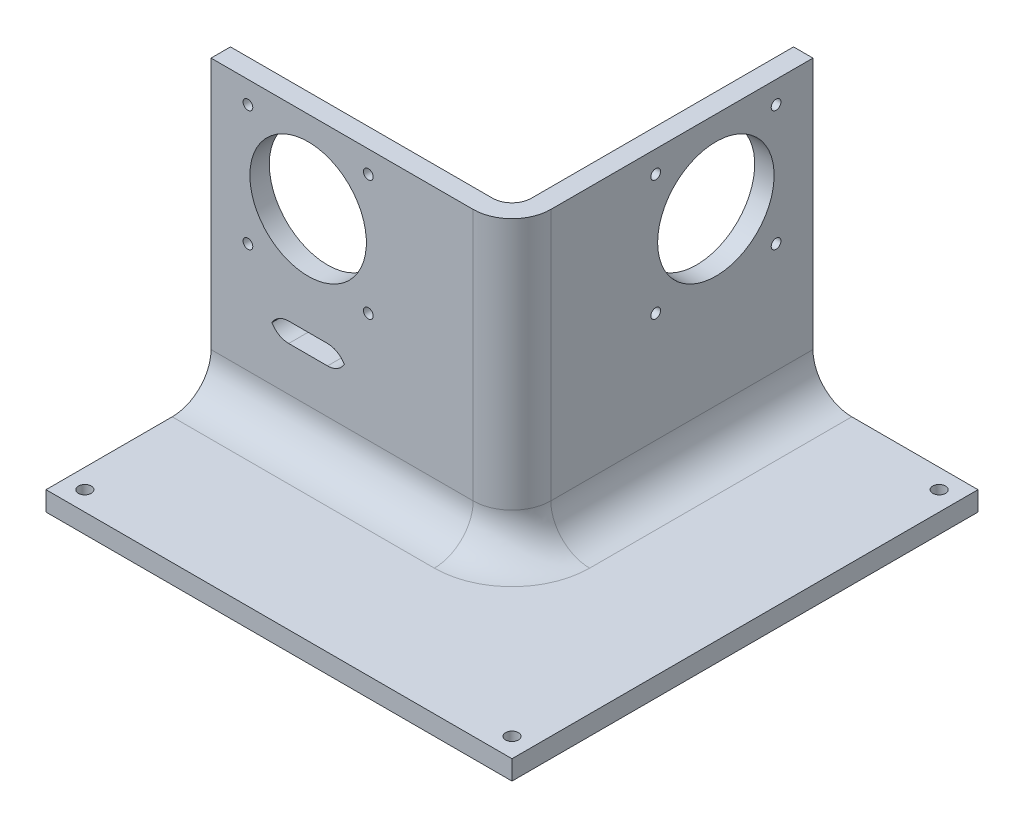
ISO-10303-21;
HEADER;
FILE_DESCRIPTION(('STEP AP214'),'2;1');
FILE_NAME('part.step','',(''),(''),'','','');
FILE_SCHEMA(('AUTOMOTIVE_DESIGN { 1 0 10303 214 1 1 1 1 }'));
ENDSEC;
DATA;
#1=APPLICATION_CONTEXT('core data for automotive mechanical design processes');
#2=APPLICATION_PROTOCOL_DEFINITION('international standard','automotive_design',2000,#1);
#3=PRODUCT_CONTEXT('',#1,'mechanical');
#4=PRODUCT('Part','Part','',(#3));
#5=PRODUCT_RELATED_PRODUCT_CATEGORY('part','',(#4));
#6=PRODUCT_DEFINITION_FORMATION('','',#4);
#7=PRODUCT_DEFINITION_CONTEXT('part definition',#1,'design');
#8=PRODUCT_DEFINITION('design','',#6,#7);
#9=PRODUCT_DEFINITION_SHAPE('','',#8);
#10=(LENGTH_UNIT() NAMED_UNIT(*) SI_UNIT(.MILLI.,.METRE.));
#11=(NAMED_UNIT(*) PLANE_ANGLE_UNIT() SI_UNIT($,.RADIAN.));
#12=(NAMED_UNIT(*) SI_UNIT($,.STERADIAN.) SOLID_ANGLE_UNIT());
#13=UNCERTAINTY_MEASURE_WITH_UNIT(LENGTH_MEASURE(1.E-05),#10,'distance_accuracy_value','');
#14=(GEOMETRIC_REPRESENTATION_CONTEXT(3) GLOBAL_UNCERTAINTY_ASSIGNED_CONTEXT((#13)) GLOBAL_UNIT_ASSIGNED_CONTEXT((#10,
#11,#12)) REPRESENTATION_CONTEXT('',''));
#15=CARTESIAN_POINT('',(0.,0.,0.));
#16=DIRECTION('',(0.,0.,1.));
#17=DIRECTION('',(1.,0.,0.));
#18=AXIS2_PLACEMENT_3D('',#15,#16,#17);
#19=CARTESIAN_POINT('',(0.,20.,-72.5));
#20=DIRECTION('',(0.,0.,-1.));
#21=DIRECTION('',(-1.,0.,0.));
#22=AXIS2_PLACEMENT_3D('',#19,#20,#21);
#23=PLANE('',#22);
#24=DIRECTION('',(0.,-1.,0.));
#25=VECTOR('',#24,1.);
#26=CARTESIAN_POINT('',(5.,80.,-72.5));
#27=LINE('',#26,#25);
#28=CARTESIAN_POINT('',(5.,80.,-72.5));
#29=VERTEX_POINT('',#28);
#30=CARTESIAN_POINT('',(5.,15.,-72.5));
#31=VERTEX_POINT('',#30);
#32=EDGE_CURVE('E281',#29,#31,#27,.T.);
#33=ORIENTED_EDGE('',*,*,#32,.T.);
#34=CARTESIAN_POINT('',(15.,15.,-72.5));
#35=DIRECTION('',(0.,0.,-1.));
#36=DIRECTION('',(-1.,0.,0.));
#37=AXIS2_PLACEMENT_3D('',#34,#35,#36);
#38=CIRCLE('',#37,10.);
#39=CARTESIAN_POINT('',(15.,5.,-72.5));
#40=VERTEX_POINT('',#39);
#41=EDGE_CURVE('E364',#31,#40,#38,.F.);
#42=ORIENTED_EDGE('',*,*,#41,.T.);
#43=DIRECTION('',(-1.,0.,0.));
#44=VECTOR('',#43,1.);
#45=CARTESIAN_POINT('',(47.5,5.,-72.5));
#46=LINE('',#45,#44);
#47=CARTESIAN_POINT('',(47.5,5.,-72.5));
#48=VERTEX_POINT('',#47);
#49=EDGE_CURVE('E202',#48,#40,#46,.T.);
#50=ORIENTED_EDGE('',*,*,#49,.F.);
#51=DIRECTION('',(0.,1.,0.));
#52=VECTOR('',#51,1.);
#53=CARTESIAN_POINT('',(47.5,-80.,-72.5));
#54=LINE('',#53,#52);
#55=CARTESIAN_POINT('',(47.5,0.,-72.5));
#56=VERTEX_POINT('',#55);
#57=EDGE_CURVE('E211',#56,#48,#54,.T.);
#58=ORIENTED_EDGE('',*,*,#57,.F.);
#59=DIRECTION('',(1.,0.,0.));
#60=VECTOR('',#59,1.);
#61=CARTESIAN_POINT('',(0.,0.,-72.5));
#62=LINE('',#61,#60);
#63=CARTESIAN_POINT('',(0.,0.,-72.5));
#64=VERTEX_POINT('',#63);
#65=EDGE_CURVE('E292',#64,#56,#62,.T.);
#66=ORIENTED_EDGE('',*,*,#65,.F.);
#67=DIRECTION('',(0.,-1.,0.));
#68=VECTOR('',#67,1.);
#69=CARTESIAN_POINT('',(0.,20.,-72.5));
#70=LINE('',#69,#68);
#71=CARTESIAN_POINT('',(0.,80.,-72.5));
#72=VERTEX_POINT('',#71);
#73=EDGE_CURVE('E295',#72,#64,#70,.T.);
#74=ORIENTED_EDGE('',*,*,#73,.F.);
#75=DIRECTION('',(-1.,0.,0.));
#76=VECTOR('',#75,1.);
#77=CARTESIAN_POINT('',(0.,80.,-72.5));
#78=LINE('',#77,#76);
#79=EDGE_CURVE('E275',#29,#72,#78,.T.);
#80=ORIENTED_EDGE('',*,*,#79,.F.);
#81=EDGE_LOOP('',(#33,#42,#50,#58,#66,#74,#80));
#82=FACE_BOUND('',#81,.T.);
#83=ADVANCED_FACE('F58',(#82),#23,.T.);
#84=CARTESIAN_POINT('',(0.,0.,0.));
#85=DIRECTION('',(0.,1.,0.));
#86=DIRECTION('',(0.,0.,1.));
#87=AXIS2_PLACEMENT_3D('',#84,#85,#86);
#88=PLANE('',#87);
#89=CARTESIAN_POINT('',(42.5,0.,-67.5));
#90=DIRECTION('',(0.,1.,0.));
#91=DIRECTION('',(0.,0.,1.));
#92=AXIS2_PLACEMENT_3D('',#89,#90,#91);
#93=CIRCLE('',#92,1.65);
#94=CARTESIAN_POINT('',(42.5,0.,-65.85));
#95=VERTEX_POINT('',#94);
#96=EDGE_CURVE('E218',#95,#95,#93,.T.);
#97=ORIENTED_EDGE('',*,*,#96,.T.);
#98=EDGE_LOOP('',(#97));
#99=FACE_BOUND('',#98,.T.);
#100=CARTESIAN_POINT('',(42.5,0.,42.5));
#101=DIRECTION('',(0.,1.,0.));
#102=DIRECTION('',(0.,0.,1.));
#103=AXIS2_PLACEMENT_3D('',#100,#101,#102);
#104=CIRCLE('',#103,1.65);
#105=CARTESIAN_POINT('',(42.5,0.,44.15));
#106=VERTEX_POINT('',#105);
#107=EDGE_CURVE('E222',#106,#106,#104,.T.);
#108=ORIENTED_EDGE('',*,*,#107,.T.);
#109=EDGE_LOOP('',(#108));
#110=FACE_BOUND('',#109,.T.);
#111=CARTESIAN_POINT('',(-67.5,0.,42.5));
#112=DIRECTION('',(0.,1.,0.));
#113=DIRECTION('',(0.,0.,1.));
#114=AXIS2_PLACEMENT_3D('',#111,#112,#113);
#115=CIRCLE('',#114,1.65);
#116=CARTESIAN_POINT('',(-67.5,0.,44.15));
#117=VERTEX_POINT('',#116);
#118=EDGE_CURVE('E337',#117,#117,#115,.T.);
#119=ORIENTED_EDGE('',*,*,#118,.T.);
#120=EDGE_LOOP('',(#119));
#121=FACE_BOUND('',#120,.T.);
#122=DIRECTION('',(0.,0.,-1.));
#123=VECTOR('',#122,1.);
#124=CARTESIAN_POINT('',(47.5,0.,0.));
#125=LINE('',#124,#123);
#126=CARTESIAN_POINT('',(47.5,0.,47.5));
#127=VERTEX_POINT('',#126);
#128=EDGE_CURVE('E334',#127,#56,#125,.T.);
#129=ORIENTED_EDGE('',*,*,#128,.F.);
#130=DIRECTION('',(-1.,0.,0.));
#131=VECTOR('',#130,1.);
#132=CARTESIAN_POINT('',(0.,0.,47.5));
#133=LINE('',#132,#131);
#134=CARTESIAN_POINT('',(-72.5,0.,47.5));
#135=VERTEX_POINT('',#134);
#136=EDGE_CURVE('E216',#127,#135,#133,.T.);
#137=ORIENTED_EDGE('',*,*,#136,.T.);
#138=DIRECTION('',(0.,0.,-1.));
#139=VECTOR('',#138,1.);
#140=CARTESIAN_POINT('',(-72.5,0.,0.));
#141=LINE('',#140,#139);
#142=CARTESIAN_POINT('',(-72.5,0.,0.));
#143=VERTEX_POINT('',#142);
#144=EDGE_CURVE('E290',#135,#143,#141,.T.);
#145=ORIENTED_EDGE('',*,*,#144,.T.);
#146=DIRECTION('',(-1.,0.,0.));
#147=VECTOR('',#146,1.);
#148=CARTESIAN_POINT('',(0.,0.,0.));
#149=LINE('',#148,#147);
#150=CARTESIAN_POINT('',(-5.,0.,0.));
#151=VERTEX_POINT('',#150);
#152=EDGE_CURVE('E287',#151,#143,#149,.T.);
#153=ORIENTED_EDGE('',*,*,#152,.F.);
#154=CARTESIAN_POINT('',(-5.,0.,-5.));
#155=DIRECTION('',(0.,1.,0.));
#156=DIRECTION('',(0.,0.,1.));
#157=AXIS2_PLACEMENT_3D('',#154,#155,#156);
#158=CIRCLE('',#157,5.);
#159=CARTESIAN_POINT('',(0.,0.,-5.));
#160=VERTEX_POINT('',#159);
#161=EDGE_CURVE('E329',#151,#160,#158,.T.);
#162=ORIENTED_EDGE('',*,*,#161,.T.);
#163=DIRECTION('',(0.,0.,1.));
#164=VECTOR('',#163,1.);
#165=CARTESIAN_POINT('',(0.,0.,0.));
#166=LINE('',#165,#164);
#167=EDGE_CURVE('E284',#64,#160,#166,.T.);
#168=ORIENTED_EDGE('',*,*,#167,.F.);
#169=ORIENTED_EDGE('',*,*,#65,.T.);
#170=EDGE_LOOP('',(#129,#137,#145,#153,#162,#168,#169));
#171=FACE_BOUND('',#170,.T.);
#172=ADVANCED_FACE('F455',(#99,#110,#121,#171),#88,.F.);
#173=CARTESIAN_POINT('',(0.,20.,0.));
#174=DIRECTION('',(1.,0.,0.));
#175=DIRECTION('',(0.,0.,-1.));
#176=AXIS2_PLACEMENT_3D('',#173,#174,#175);
#177=PLANE('',#176);
#178=CARTESIAN_POINT('',(0.,43.35,-32.));
#179=DIRECTION('',(-1.,0.,0.));
#180=DIRECTION('',(0.,0.,1.));
#181=AXIS2_PLACEMENT_3D('',#178,#179,#180);
#182=CIRCLE('',#181,1.25);
#183=CARTESIAN_POINT('',(0.,43.35,-30.75));
#184=VERTEX_POINT('',#183);
#185=EDGE_CURVE('E255',#184,#184,#182,.T.);
#186=ORIENTED_EDGE('',*,*,#185,.F.);
#187=EDGE_LOOP('',(#186));
#188=FACE_BOUND('',#187,.T.);
#189=CARTESIAN_POINT('',(0.,43.35,-63.));
#190=DIRECTION('',(-1.,0.,0.));
#191=DIRECTION('',(0.,0.,1.));
#192=AXIS2_PLACEMENT_3D('',#189,#190,#191);
#193=CIRCLE('',#192,1.25);
#194=CARTESIAN_POINT('',(0.,43.35,-61.75));
#195=VERTEX_POINT('',#194);
#196=EDGE_CURVE('E260',#195,#195,#193,.T.);
#197=ORIENTED_EDGE('',*,*,#196,.F.);
#198=EDGE_LOOP('',(#197));
#199=FACE_BOUND('',#198,.T.);
#200=CARTESIAN_POINT('',(0.,74.35,-63.));
#201=DIRECTION('',(-1.,0.,0.));
#202=DIRECTION('',(0.,0.,1.));
#203=AXIS2_PLACEMENT_3D('',#200,#201,#202);
#204=CIRCLE('',#203,1.25);
#205=CARTESIAN_POINT('',(0.,74.35,-61.75));
#206=VERTEX_POINT('',#205);
#207=EDGE_CURVE('E256',#206,#206,#204,.T.);
#208=ORIENTED_EDGE('',*,*,#207,.F.);
#209=EDGE_LOOP('',(#208));
#210=FACE_BOUND('',#209,.T.);
#211=CARTESIAN_POINT('',(0.,74.35,-32.));
#212=DIRECTION('',(-1.,0.,0.));
#213=DIRECTION('',(0.,0.,1.));
#214=AXIS2_PLACEMENT_3D('',#211,#212,#213);
#215=CIRCLE('',#214,1.25);
#216=CARTESIAN_POINT('',(0.,74.35,-30.75));
#217=VERTEX_POINT('',#216);
#218=EDGE_CURVE('E259',#217,#217,#215,.T.);
#219=ORIENTED_EDGE('',*,*,#218,.F.);
#220=EDGE_LOOP('',(#219));
#221=FACE_BOUND('',#220,.T.);
#222=CARTESIAN_POINT('',(0.,58.85,-47.5));
#223=DIRECTION('',(-1.,0.,0.));
#224=DIRECTION('',(0.,0.,1.));
#225=AXIS2_PLACEMENT_3D('',#222,#223,#224);
#226=CIRCLE('',#225,15.);
#227=CARTESIAN_POINT('',(0.,58.85,-32.5));
#228=VERTEX_POINT('',#227);
#229=EDGE_CURVE('E268',#228,#228,#226,.T.);
#230=ORIENTED_EDGE('',*,*,#229,.F.);
#231=EDGE_LOOP('',(#230));
#232=FACE_BOUND('',#231,.T.);
#233=ORIENTED_EDGE('',*,*,#167,.T.);
#234=DIRECTION('',(0.,-1.,0.));
#235=VECTOR('',#234,1.);
#236=CARTESIAN_POINT('',(0.,80.,-5.));
#237=LINE('',#236,#235);
#238=CARTESIAN_POINT('',(0.,80.,-5.));
#239=VERTEX_POINT('',#238);
#240=EDGE_CURVE('E327',#160,#239,#237,.F.);
#241=ORIENTED_EDGE('',*,*,#240,.T.);
#242=DIRECTION('',(0.,0.,1.));
#243=VECTOR('',#242,1.);
#244=CARTESIAN_POINT('',(0.,80.,0.));
#245=LINE('',#244,#243);
#246=EDGE_CURVE('E278',#72,#239,#245,.T.);
#247=ORIENTED_EDGE('',*,*,#246,.F.);
#248=ORIENTED_EDGE('',*,*,#73,.T.);
#249=EDGE_LOOP('',(#233,#241,#247,#248));
#250=FACE_BOUND('',#249,.T.);
#251=ADVANCED_FACE('F461',(#188,#199,#210,#221,#232,#250),#177,.F.);
#252=CARTESIAN_POINT('',(0.,20.,0.));
#253=DIRECTION('',(0.,0.,1.));
#254=DIRECTION('',(1.,0.,0.));
#255=AXIS2_PLACEMENT_3D('',#252,#253,#254);
#256=PLANE('',#255);
#257=DIRECTION('',(-1.,0.,0.));
#258=VECTOR('',#257,1.);
#259=CARTESIAN_POINT('',(0.,31.35,0.));
#260=LINE('',#259,#258);
#261=CARTESIAN_POINT('',(-42.5,31.35,0.));
#262=VERTEX_POINT('',#261);
#263=CARTESIAN_POINT('',(-52.5,31.35,0.));
#264=VERTEX_POINT('',#263);
#265=EDGE_CURVE('E421',#262,#264,#260,.T.);
#266=ORIENTED_EDGE('',*,*,#265,.T.);
#267=CARTESIAN_POINT('',(-52.5,26.35,0.));
#268=DIRECTION('',(0.,0.,1.));
#269=DIRECTION('',(1.,0.,0.));
#270=AXIS2_PLACEMENT_3D('',#267,#268,#269);
#271=CIRCLE('',#270,5.);
#272=CARTESIAN_POINT('',(-56.8301270189222,28.85,0.));
#273=VERTEX_POINT('',#272);
#274=EDGE_CURVE('E392',#264,#273,#271,.T.);
#275=ORIENTED_EDGE('',*,*,#274,.T.);
#276=CARTESIAN_POINT('',(-52.5,31.35,0.));
#277=DIRECTION('',(0.,0.,1.));
#278=DIRECTION('',(1.,0.,0.));
#279=AXIS2_PLACEMENT_3D('',#276,#277,#278);
#280=CIRCLE('',#279,5.);
#281=CARTESIAN_POINT('',(-52.5,26.35,0.));
#282=VERTEX_POINT('',#281);
#283=EDGE_CURVE('E388',#273,#282,#280,.T.);
#284=ORIENTED_EDGE('',*,*,#283,.T.);
#285=DIRECTION('',(1.,0.,0.));
#286=VECTOR('',#285,1.);
#287=CARTESIAN_POINT('',(0.,26.35,0.));
#288=LINE('',#287,#286);
#289=CARTESIAN_POINT('',(-42.5,26.35,0.));
#290=VERTEX_POINT('',#289);
#291=EDGE_CURVE('E371',#282,#290,#288,.T.);
#292=ORIENTED_EDGE('',*,*,#291,.T.);
#293=CARTESIAN_POINT('',(-42.5,31.35,0.));
#294=DIRECTION('',(0.,0.,1.));
#295=DIRECTION('',(1.,0.,0.));
#296=AXIS2_PLACEMENT_3D('',#293,#294,#295);
#297=CIRCLE('',#296,5.);
#298=CARTESIAN_POINT('',(-38.1698729810778,28.85,0.));
#299=VERTEX_POINT('',#298);
#300=EDGE_CURVE('E12',#290,#299,#297,.T.);
#301=ORIENTED_EDGE('',*,*,#300,.T.);
#302=CARTESIAN_POINT('',(-42.5,26.35,0.));
#303=DIRECTION('',(0.,0.,1.));
#304=DIRECTION('',(1.,0.,0.));
#305=AXIS2_PLACEMENT_3D('',#302,#303,#304);
#306=CIRCLE('',#305,5.);
#307=EDGE_CURVE('E395',#299,#262,#306,.T.);
#308=ORIENTED_EDGE('',*,*,#307,.T.);
#309=EDGE_LOOP('',(#266,#275,#284,#292,#301,#308));
#310=FACE_BOUND('',#309,.T.);
#311=CARTESIAN_POINT('',(-32.,43.35,0.));
#312=DIRECTION('',(0.,0.,1.));
#313=DIRECTION('',(1.,0.,0.));
#314=AXIS2_PLACEMENT_3D('',#311,#312,#313);
#315=CIRCLE('',#314,1.25);
#316=CARTESIAN_POINT('',(-30.75,43.35,0.));
#317=VERTEX_POINT('',#316);
#318=EDGE_CURVE('E233',#317,#317,#315,.T.);
#319=ORIENTED_EDGE('',*,*,#318,.T.);
#320=EDGE_LOOP('',(#319));
#321=FACE_BOUND('',#320,.T.);
#322=CARTESIAN_POINT('',(-63.,43.35,0.));
#323=DIRECTION('',(0.,0.,1.));
#324=DIRECTION('',(1.,0.,0.));
#325=AXIS2_PLACEMENT_3D('',#322,#323,#324);
#326=CIRCLE('',#325,1.25);
#327=CARTESIAN_POINT('',(-61.75,43.35,0.));
#328=VERTEX_POINT('',#327);
#329=EDGE_CURVE('E230',#328,#328,#326,.T.);
#330=ORIENTED_EDGE('',*,*,#329,.T.);
#331=EDGE_LOOP('',(#330));
#332=FACE_BOUND('',#331,.T.);
#333=CARTESIAN_POINT('',(-63.,74.35,0.));
#334=DIRECTION('',(0.,0.,1.));
#335=DIRECTION('',(1.,0.,0.));
#336=AXIS2_PLACEMENT_3D('',#333,#334,#335);
#337=CIRCLE('',#336,1.25);
#338=CARTESIAN_POINT('',(-61.75,74.35,0.));
#339=VERTEX_POINT('',#338);
#340=EDGE_CURVE('E226',#339,#339,#337,.T.);
#341=ORIENTED_EDGE('',*,*,#340,.T.);
#342=EDGE_LOOP('',(#341));
#343=FACE_BOUND('',#342,.T.);
#344=CARTESIAN_POINT('',(-32.,74.35,0.));
#345=DIRECTION('',(0.,0.,1.));
#346=DIRECTION('',(1.,0.,0.));
#347=AXIS2_PLACEMENT_3D('',#344,#345,#346);
#348=CIRCLE('',#347,1.25);
#349=CARTESIAN_POINT('',(-30.75,74.35,0.));
#350=VERTEX_POINT('',#349);
#351=EDGE_CURVE('E229',#350,#350,#348,.T.);
#352=ORIENTED_EDGE('',*,*,#351,.T.);
#353=EDGE_LOOP('',(#352));
#354=FACE_BOUND('',#353,.T.);
#355=CARTESIAN_POINT('',(-47.5,58.85,0.));
#356=DIRECTION('',(0.,0.,1.));
#357=DIRECTION('',(1.,0.,0.));
#358=AXIS2_PLACEMENT_3D('',#355,#356,#357);
#359=CIRCLE('',#358,15.);
#360=CARTESIAN_POINT('',(-32.5,58.85,0.));
#361=VERTEX_POINT('',#360);
#362=EDGE_CURVE('E239',#361,#361,#359,.T.);
#363=ORIENTED_EDGE('',*,*,#362,.T.);
#364=EDGE_LOOP('',(#363));
#365=FACE_BOUND('',#364,.T.);
#366=DIRECTION('',(-1.,0.,0.));
#367=VECTOR('',#366,1.);
#368=CARTESIAN_POINT('',(-72.5,80.,0.));
#369=LINE('',#368,#367);
#370=CARTESIAN_POINT('',(-5.,80.,0.));
#371=VERTEX_POINT('',#370);
#372=CARTESIAN_POINT('',(-72.5,80.,0.));
#373=VERTEX_POINT('',#372);
#374=EDGE_CURVE('E250',#371,#373,#369,.T.);
#375=ORIENTED_EDGE('',*,*,#374,.F.);
#376=DIRECTION('',(0.,-1.,0.));
#377=VECTOR('',#376,1.);
#378=CARTESIAN_POINT('',(-5.,0.,0.));
#379=LINE('',#378,#377);
#380=EDGE_CURVE('E300',#371,#151,#379,.T.);
#381=ORIENTED_EDGE('',*,*,#380,.T.);
#382=ORIENTED_EDGE('',*,*,#152,.T.);
#383=DIRECTION('',(0.,-1.,0.));
#384=VECTOR('',#383,1.);
#385=CARTESIAN_POINT('',(-72.5,20.,0.));
#386=LINE('',#385,#384);
#387=EDGE_CURVE('E297',#373,#143,#386,.T.);
#388=ORIENTED_EDGE('',*,*,#387,.F.);
#389=EDGE_LOOP('',(#375,#381,#382,#388));
#390=FACE_BOUND('',#389,.T.);
#391=ADVANCED_FACE('F470',(#310,#321,#332,#343,#354,#365,#390),#256,.F.);
#392=CARTESIAN_POINT('',(-72.5,20.,0.));
#393=DIRECTION('',(-1.,0.,0.));
#394=DIRECTION('',(0.,0.,1.));
#395=AXIS2_PLACEMENT_3D('',#392,#393,#394);
#396=PLANE('',#395);
#397=DIRECTION('',(0.,0.,1.));
#398=VECTOR('',#397,1.);
#399=CARTESIAN_POINT('',(-72.5,5.,5.00000000000002));
#400=LINE('',#399,#398);
#401=CARTESIAN_POINT('',(-72.5,5.,15.));
#402=VERTEX_POINT('',#401);
#403=CARTESIAN_POINT('',(-72.5,5.,47.5));
#404=VERTEX_POINT('',#403);
#405=EDGE_CURVE('E198',#402,#404,#400,.T.);
#406=ORIENTED_EDGE('',*,*,#405,.F.);
#407=CARTESIAN_POINT('',(-72.5,15.,15.));
#408=DIRECTION('',(-1.,0.,0.));
#409=DIRECTION('',(0.,0.,1.));
#410=AXIS2_PLACEMENT_3D('',#407,#408,#409);
#411=CIRCLE('',#410,10.);
#412=CARTESIAN_POINT('',(-72.5,15.,5.00000000000001));
#413=VERTEX_POINT('',#412);
#414=EDGE_CURVE('E362',#402,#413,#411,.F.);
#415=ORIENTED_EDGE('',*,*,#414,.T.);
#416=DIRECTION('',(0.,-1.,0.));
#417=VECTOR('',#416,1.);
#418=CARTESIAN_POINT('',(-72.5,80.,5.00000000000001));
#419=LINE('',#418,#417);
#420=CARTESIAN_POINT('',(-72.5,80.,5.00000000000001));
#421=VERTEX_POINT('',#420);
#422=EDGE_CURVE('E252',#421,#413,#419,.T.);
#423=ORIENTED_EDGE('',*,*,#422,.F.);
#424=DIRECTION('',(0.,0.,1.));
#425=VECTOR('',#424,1.);
#426=CARTESIAN_POINT('',(-72.5,80.,0.));
#427=LINE('',#426,#425);
#428=EDGE_CURVE('E244',#373,#421,#427,.T.);
#429=ORIENTED_EDGE('',*,*,#428,.F.);
#430=ORIENTED_EDGE('',*,*,#387,.T.);
#431=ORIENTED_EDGE('',*,*,#144,.F.);
#432=DIRECTION('',(0.,1.,0.));
#433=VECTOR('',#432,1.);
#434=CARTESIAN_POINT('',(-72.5,-80.,47.5));
#435=LINE('',#434,#433);
#436=EDGE_CURVE('E217',#135,#404,#435,.T.);
#437=ORIENTED_EDGE('',*,*,#436,.T.);
#438=EDGE_LOOP('',(#406,#415,#423,#429,#430,#431,#437));
#439=FACE_BOUND('',#438,.T.);
#440=ADVANCED_FACE('F466',(#439),#396,.T.);
#441=CARTESIAN_POINT('',(5.,80.,0.));
#442=DIRECTION('',(-1.,0.,0.));
#443=DIRECTION('',(0.,0.,1.));
#444=AXIS2_PLACEMENT_3D('',#441,#442,#443);
#445=PLANE('',#444);
#446=CARTESIAN_POINT('',(5.,43.35,-32.));
#447=DIRECTION('',(-1.,0.,0.));
#448=DIRECTION('',(0.,0.,1.));
#449=AXIS2_PLACEMENT_3D('',#446,#447,#448);
#450=CIRCLE('',#449,1.25);
#451=CARTESIAN_POINT('',(5.,43.35,-30.75));
#452=VERTEX_POINT('',#451);
#453=EDGE_CURVE('E272',#452,#452,#450,.T.);
#454=ORIENTED_EDGE('',*,*,#453,.T.);
#455=EDGE_LOOP('',(#454));
#456=FACE_BOUND('',#455,.T.);
#457=CARTESIAN_POINT('',(5.,43.35,-63.));
#458=DIRECTION('',(-1.,0.,0.));
#459=DIRECTION('',(0.,0.,1.));
#460=AXIS2_PLACEMENT_3D('',#457,#458,#459);
#461=CIRCLE('',#460,1.25);
#462=CARTESIAN_POINT('',(5.,43.35,-61.75));
#463=VERTEX_POINT('',#462);
#464=EDGE_CURVE('E308',#463,#463,#461,.T.);
#465=ORIENTED_EDGE('',*,*,#464,.T.);
#466=EDGE_LOOP('',(#465));
#467=FACE_BOUND('',#466,.T.);
#468=CARTESIAN_POINT('',(5.,74.35,-63.));
#469=DIRECTION('',(-1.,0.,0.));
#470=DIRECTION('',(0.,0.,1.));
#471=AXIS2_PLACEMENT_3D('',#468,#469,#470);
#472=CIRCLE('',#471,1.25);
#473=CARTESIAN_POINT('',(5.,74.35,-61.75));
#474=VERTEX_POINT('',#473);
#475=EDGE_CURVE('E305',#474,#474,#472,.T.);
#476=ORIENTED_EDGE('',*,*,#475,.T.);
#477=EDGE_LOOP('',(#476));
#478=FACE_BOUND('',#477,.T.);
#479=CARTESIAN_POINT('',(5.,74.35,-32.));
#480=DIRECTION('',(-1.,0.,0.));
#481=DIRECTION('',(0.,0.,1.));
#482=AXIS2_PLACEMENT_3D('',#479,#480,#481);
#483=CIRCLE('',#482,1.25);
#484=CARTESIAN_POINT('',(5.,74.35,-30.75));
#485=VERTEX_POINT('',#484);
#486=EDGE_CURVE('E267',#485,#485,#483,.T.);
#487=ORIENTED_EDGE('',*,*,#486,.T.);
#488=EDGE_LOOP('',(#487));
#489=FACE_BOUND('',#488,.T.);
#490=CARTESIAN_POINT('',(5.,58.85,-47.5));
#491=DIRECTION('',(-1.,0.,0.));
#492=DIRECTION('',(0.,0.,1.));
#493=AXIS2_PLACEMENT_3D('',#490,#491,#492);
#494=CIRCLE('',#493,15.);
#495=CARTESIAN_POINT('',(5.,58.85,-32.5));
#496=VERTEX_POINT('',#495);
#497=EDGE_CURVE('E271',#496,#496,#494,.T.);
#498=ORIENTED_EDGE('',*,*,#497,.T.);
#499=EDGE_LOOP('',(#498));
#500=FACE_BOUND('',#499,.T.);
#501=DIRECTION('',(0.,-1.,0.));
#502=VECTOR('',#501,1.);
#503=CARTESIAN_POINT('',(5.,80.,-4.99999999999999));
#504=LINE('',#503,#502);
#505=CARTESIAN_POINT('',(5.,80.,-4.99999999999999));
#506=VERTEX_POINT('',#505);
#507=CARTESIAN_POINT('',(5.,15.,-4.99999999999999));
#508=VERTEX_POINT('',#507);
#509=EDGE_CURVE('E356',#506,#508,#504,.T.);
#510=ORIENTED_EDGE('',*,*,#509,.T.);
#511=DIRECTION('',(0.,0.,-1.));
#512=VECTOR('',#511,1.);
#513=CARTESIAN_POINT('',(5.,15.,-72.5));
#514=LINE('',#513,#512);
#515=EDGE_CURVE('E358',#508,#31,#514,.T.);
#516=ORIENTED_EDGE('',*,*,#515,.T.);
#517=ORIENTED_EDGE('',*,*,#32,.F.);
#518=DIRECTION('',(0.,0.,-1.));
#519=VECTOR('',#518,1.);
#520=CARTESIAN_POINT('',(5.,80.,0.));
#521=LINE('',#520,#519);
#522=EDGE_CURVE('E273',#506,#29,#521,.T.);
#523=ORIENTED_EDGE('',*,*,#522,.F.);
#524=EDGE_LOOP('',(#510,#516,#517,#523));
#525=FACE_BOUND('',#524,.T.);
#526=ADVANCED_FACE('F469',(#456,#467,#478,#489,#500,#525),#445,.F.);
#527=CARTESIAN_POINT('',(0.,80.,0.));
#528=DIRECTION('',(0.,-1.,0.));
#529=DIRECTION('',(0.,0.,-1.));
#530=AXIS2_PLACEMENT_3D('',#527,#528,#529);
#531=PLANE('',#530);
#532=DIRECTION('',(1.,0.,0.));
#533=VECTOR('',#532,1.);
#534=CARTESIAN_POINT('',(-72.5,80.,5.00000000000001));
#535=LINE('',#534,#533);
#536=CARTESIAN_POINT('',(-5.,80.,5.00000000000001));
#537=VERTEX_POINT('',#536);
#538=EDGE_CURVE('E247',#421,#537,#535,.T.);
#539=ORIENTED_EDGE('',*,*,#538,.T.);
#540=CARTESIAN_POINT('',(-5.,80.,-4.99999999999999));
#541=DIRECTION('',(0.,-1.,0.));
#542=DIRECTION('',(0.,0.,-1.));
#543=AXIS2_PLACEMENT_3D('',#540,#541,#542);
#544=CIRCLE('',#543,10.);
#545=EDGE_CURVE('E360',#537,#506,#544,.F.);
#546=ORIENTED_EDGE('',*,*,#545,.T.);
#547=ORIENTED_EDGE('',*,*,#522,.T.);
#548=ORIENTED_EDGE('',*,*,#79,.T.);
#549=ORIENTED_EDGE('',*,*,#246,.T.);
#550=CARTESIAN_POINT('',(-5.,80.,-5.));
#551=DIRECTION('',(0.,-1.,0.));
#552=DIRECTION('',(0.,0.,-1.));
#553=AXIS2_PLACEMENT_3D('',#550,#551,#552);
#554=CIRCLE('',#553,5.);
#555=EDGE_CURVE('E331',#239,#371,#554,.T.);
#556=ORIENTED_EDGE('',*,*,#555,.T.);
#557=ORIENTED_EDGE('',*,*,#374,.T.);
#558=ORIENTED_EDGE('',*,*,#428,.T.);
#559=EDGE_LOOP('',(#539,#546,#547,#548,#549,#556,#557,#558));
#560=FACE_BOUND('',#559,.T.);
#561=ADVANCED_FACE('F554',(#560),#531,.F.);
#562=CARTESIAN_POINT('',(100.,58.85,-47.5));
#563=DIRECTION('',(-1.,0.,0.));
#564=DIRECTION('',(0.,0.,1.));
#565=AXIS2_PLACEMENT_3D('',#562,#563,#564);
#566=CYLINDRICAL_SURFACE('',#565,15.);
#567=ORIENTED_EDGE('',*,*,#229,.T.);
#568=EDGE_LOOP('',(#567));
#569=FACE_BOUND('',#568,.T.);
#570=ORIENTED_EDGE('',*,*,#497,.F.);
#571=EDGE_LOOP('',(#570));
#572=FACE_BOUND('',#571,.T.);
#573=ADVANCED_FACE('F559',(#569,#572),#566,.F.);
#574=CARTESIAN_POINT('',(100.,74.35,-32.));
#575=DIRECTION('',(-1.,0.,0.));
#576=DIRECTION('',(0.,0.,1.));
#577=AXIS2_PLACEMENT_3D('',#574,#575,#576);
#578=CYLINDRICAL_SURFACE('',#577,1.25);
#579=ORIENTED_EDGE('',*,*,#218,.T.);
#580=EDGE_LOOP('',(#579));
#581=FACE_BOUND('',#580,.T.);
#582=ORIENTED_EDGE('',*,*,#486,.F.);
#583=EDGE_LOOP('',(#582));
#584=FACE_BOUND('',#583,.T.);
#585=ADVANCED_FACE('F724',(#581,#584),#578,.F.);
#586=CARTESIAN_POINT('',(100.,74.35,-62.9999999999999));
#587=DIRECTION('',(-1.,0.,0.));
#588=DIRECTION('',(0.,0.,1.));
#589=AXIS2_PLACEMENT_3D('',#586,#587,#588);
#590=CYLINDRICAL_SURFACE('',#589,1.25);
#591=ORIENTED_EDGE('',*,*,#207,.T.);
#592=EDGE_LOOP('',(#591));
#593=FACE_BOUND('',#592,.T.);
#594=ORIENTED_EDGE('',*,*,#475,.F.);
#595=EDGE_LOOP('',(#594));
#596=FACE_BOUND('',#595,.T.);
#597=ADVANCED_FACE('F714',(#593,#596),#590,.F.);
#598=CARTESIAN_POINT('',(100.,43.35,-63.));
#599=DIRECTION('',(-1.,0.,0.));
#600=DIRECTION('',(0.,0.,1.));
#601=AXIS2_PLACEMENT_3D('',#598,#599,#600);
#602=CYLINDRICAL_SURFACE('',#601,1.25);
#603=ORIENTED_EDGE('',*,*,#196,.T.);
#604=EDGE_LOOP('',(#603));
#605=FACE_BOUND('',#604,.T.);
#606=ORIENTED_EDGE('',*,*,#464,.F.);
#607=EDGE_LOOP('',(#606));
#608=FACE_BOUND('',#607,.T.);
#609=ADVANCED_FACE('F704',(#605,#608),#602,.F.);
#610=CARTESIAN_POINT('',(100.,43.35,-32.));
#611=DIRECTION('',(-1.,0.,0.));
#612=DIRECTION('',(0.,0.,1.));
#613=AXIS2_PLACEMENT_3D('',#610,#611,#612);
#614=CYLINDRICAL_SURFACE('',#613,1.25);
#615=ORIENTED_EDGE('',*,*,#185,.T.);
#616=EDGE_LOOP('',(#615));
#617=FACE_BOUND('',#616,.T.);
#618=ORIENTED_EDGE('',*,*,#453,.F.);
#619=EDGE_LOOP('',(#618));
#620=FACE_BOUND('',#619,.T.);
#621=ADVANCED_FACE('F699',(#617,#620),#614,.F.);
#622=CARTESIAN_POINT('',(-72.5,80.,5.00000000000001));
#623=DIRECTION('',(0.,0.,-1.));
#624=DIRECTION('',(-1.,0.,0.));
#625=AXIS2_PLACEMENT_3D('',#622,#623,#624);
#626=PLANE('',#625);
#627=CARTESIAN_POINT('',(-42.5,26.35,5.00000000000001));
#628=DIRECTION('',(0.,0.,-1.));
#629=DIRECTION('',(-1.,0.,0.));
#630=AXIS2_PLACEMENT_3D('',#627,#628,#629);
#631=CIRCLE('',#630,5.);
#632=CARTESIAN_POINT('',(-42.5,31.35,5.00000000000001));
#633=VERTEX_POINT('',#632);
#634=CARTESIAN_POINT('',(-38.1698729810778,28.85,5.00000000000001));
#635=VERTEX_POINT('',#634);
#636=EDGE_CURVE('E81',#633,#635,#631,.T.);
#637=ORIENTED_EDGE('',*,*,#636,.T.);
#638=CARTESIAN_POINT('',(-42.5,31.35,5.00000000000001));
#639=DIRECTION('',(0.,0.,-1.));
#640=DIRECTION('',(-1.,0.,0.));
#641=AXIS2_PLACEMENT_3D('',#638,#639,#640);
#642=CIRCLE('',#641,5.);
#643=CARTESIAN_POINT('',(-42.5,26.35,5.00000000000001));
#644=VERTEX_POINT('',#643);
#645=EDGE_CURVE('E67',#635,#644,#642,.T.);
#646=ORIENTED_EDGE('',*,*,#645,.T.);
#647=DIRECTION('',(1.,0.,0.));
#648=VECTOR('',#647,1.);
#649=CARTESIAN_POINT('',(-57.5,26.35,5.00000000000001));
#650=LINE('',#649,#648);
#651=CARTESIAN_POINT('',(-52.5,26.35,5.00000000000001));
#652=VERTEX_POINT('',#651);
#653=EDGE_CURVE('E404',#652,#644,#650,.T.);
#654=ORIENTED_EDGE('',*,*,#653,.F.);
#655=CARTESIAN_POINT('',(-52.5,31.35,5.00000000000001));
#656=DIRECTION('',(0.,0.,-1.));
#657=DIRECTION('',(-1.,0.,0.));
#658=AXIS2_PLACEMENT_3D('',#655,#656,#657);
#659=CIRCLE('',#658,5.);
#660=CARTESIAN_POINT('',(-56.8301270189222,28.85,5.00000000000001));
#661=VERTEX_POINT('',#660);
#662=EDGE_CURVE('E386',#652,#661,#659,.T.);
#663=ORIENTED_EDGE('',*,*,#662,.T.);
#664=CARTESIAN_POINT('',(-52.5,26.35,5.00000000000001));
#665=DIRECTION('',(0.,0.,-1.));
#666=DIRECTION('',(-1.,0.,0.));
#667=AXIS2_PLACEMENT_3D('',#664,#665,#666);
#668=CIRCLE('',#667,5.);
#669=CARTESIAN_POINT('',(-52.5,31.35,5.00000000000001));
#670=VERTEX_POINT('',#669);
#671=EDGE_CURVE('E390',#661,#670,#668,.T.);
#672=ORIENTED_EDGE('',*,*,#671,.T.);
#673=DIRECTION('',(-1.,0.,0.));
#674=VECTOR('',#673,1.);
#675=CARTESIAN_POINT('',(-57.5,31.35,5.00000000000001));
#676=LINE('',#675,#674);
#677=EDGE_CURVE('E399',#633,#670,#676,.T.);
#678=ORIENTED_EDGE('',*,*,#677,.F.);
#679=EDGE_LOOP('',(#637,#646,#654,#663,#672,#678));
#680=FACE_BOUND('',#679,.T.);
#681=CARTESIAN_POINT('',(-32.,43.35,5.));
#682=DIRECTION('',(0.,0.,-1.));
#683=DIRECTION('',(-1.,0.,0.));
#684=AXIS2_PLACEMENT_3D('',#681,#682,#683);
#685=CIRCLE('',#684,1.25);
#686=CARTESIAN_POINT('',(-33.25,43.35,5.));
#687=VERTEX_POINT('',#686);
#688=EDGE_CURVE('E243',#687,#687,#685,.F.);
#689=ORIENTED_EDGE('',*,*,#688,.F.);
#690=EDGE_LOOP('',(#689));
#691=FACE_BOUND('',#690,.T.);
#692=CARTESIAN_POINT('',(-63.,43.35,5.));
#693=DIRECTION('',(0.,0.,-1.));
#694=DIRECTION('',(-1.,0.,0.));
#695=AXIS2_PLACEMENT_3D('',#692,#693,#694);
#696=CIRCLE('',#695,1.25);
#697=CARTESIAN_POINT('',(-64.25,43.35,5.));
#698=VERTEX_POINT('',#697);
#699=EDGE_CURVE('E320',#698,#698,#696,.F.);
#700=ORIENTED_EDGE('',*,*,#699,.F.);
#701=EDGE_LOOP('',(#700));
#702=FACE_BOUND('',#701,.T.);
#703=CARTESIAN_POINT('',(-62.9999999999999,74.35,5.));
#704=DIRECTION('',(0.,0.,-1.));
#705=DIRECTION('',(-1.,0.,0.));
#706=AXIS2_PLACEMENT_3D('',#703,#704,#705);
#707=CIRCLE('',#706,1.25);
#708=CARTESIAN_POINT('',(-64.2499999999999,74.35,5.));
#709=VERTEX_POINT('',#708);
#710=EDGE_CURVE('E317',#709,#709,#707,.F.);
#711=ORIENTED_EDGE('',*,*,#710,.F.);
#712=EDGE_LOOP('',(#711));
#713=FACE_BOUND('',#712,.T.);
#714=CARTESIAN_POINT('',(-32.,74.35,5.));
#715=DIRECTION('',(0.,0.,-1.));
#716=DIRECTION('',(-1.,0.,0.));
#717=AXIS2_PLACEMENT_3D('',#714,#715,#716);
#718=CIRCLE('',#717,1.25);
#719=CARTESIAN_POINT('',(-33.25,74.35,5.));
#720=VERTEX_POINT('',#719);
#721=EDGE_CURVE('E238',#720,#720,#718,.F.);
#722=ORIENTED_EDGE('',*,*,#721,.F.);
#723=EDGE_LOOP('',(#722));
#724=FACE_BOUND('',#723,.T.);
#725=CARTESIAN_POINT('',(-47.5,58.85,5.));
#726=DIRECTION('',(0.,0.,-1.));
#727=DIRECTION('',(-1.,0.,0.));
#728=AXIS2_PLACEMENT_3D('',#725,#726,#727);
#729=CIRCLE('',#728,15.);
#730=CARTESIAN_POINT('',(-62.5,58.85,5.));
#731=VERTEX_POINT('',#730);
#732=EDGE_CURVE('E242',#731,#731,#729,.F.);
#733=ORIENTED_EDGE('',*,*,#732,.F.);
#734=EDGE_LOOP('',(#733));
#735=FACE_BOUND('',#734,.T.);
#736=ORIENTED_EDGE('',*,*,#422,.T.);
#737=DIRECTION('',(-1.,0.,0.));
#738=VECTOR('',#737,1.);
#739=CARTESIAN_POINT('',(5.,15.,5.00000000000001));
#740=LINE('',#739,#738);
#741=CARTESIAN_POINT('',(-5.,15.,5.00000000000001));
#742=VERTEX_POINT('',#741);
#743=EDGE_CURVE('E354',#413,#742,#740,.F.);
#744=ORIENTED_EDGE('',*,*,#743,.T.);
#745=DIRECTION('',(0.,-1.,0.));
#746=VECTOR('',#745,1.);
#747=CARTESIAN_POINT('',(-5.,80.,5.00000000000001));
#748=LINE('',#747,#746);
#749=EDGE_CURVE('E352',#742,#537,#748,.F.);
#750=ORIENTED_EDGE('',*,*,#749,.T.);
#751=ORIENTED_EDGE('',*,*,#538,.F.);
#752=EDGE_LOOP('',(#736,#744,#750,#751));
#753=FACE_BOUND('',#752,.T.);
#754=ADVANCED_FACE('F415',(#680,#691,#702,#713,#724,#735,#753),#626,.F.);
#755=CARTESIAN_POINT('',(-47.4999999999999,58.85,100.));
#756=DIRECTION('',(0.,0.,-1.));
#757=DIRECTION('',(-1.,0.,0.));
#758=AXIS2_PLACEMENT_3D('',#755,#756,#757);
#759=CYLINDRICAL_SURFACE('',#758,15.);
#760=ORIENTED_EDGE('',*,*,#362,.F.);
#761=EDGE_LOOP('',(#760));
#762=FACE_BOUND('',#761,.T.);
#763=ORIENTED_EDGE('',*,*,#732,.T.);
#764=EDGE_LOOP('',(#763));
#765=FACE_BOUND('',#764,.T.);
#766=ADVANCED_FACE('F683',(#762,#765),#759,.F.);
#767=CARTESIAN_POINT('',(-31.9999999999999,74.35,100.));
#768=DIRECTION('',(0.,0.,-1.));
#769=DIRECTION('',(-1.,0.,0.));
#770=AXIS2_PLACEMENT_3D('',#767,#768,#769);
#771=CYLINDRICAL_SURFACE('',#770,1.25);
#772=ORIENTED_EDGE('',*,*,#351,.F.);
#773=EDGE_LOOP('',(#772));
#774=FACE_BOUND('',#773,.T.);
#775=ORIENTED_EDGE('',*,*,#721,.T.);
#776=EDGE_LOOP('',(#775));
#777=FACE_BOUND('',#776,.T.);
#778=ADVANCED_FACE('F673',(#774,#777),#771,.F.);
#779=CARTESIAN_POINT('',(-62.9999999999999,74.35,100.));
#780=DIRECTION('',(0.,0.,-1.));
#781=DIRECTION('',(-1.,0.,0.));
#782=AXIS2_PLACEMENT_3D('',#779,#780,#781);
#783=CYLINDRICAL_SURFACE('',#782,1.25);
#784=ORIENTED_EDGE('',*,*,#340,.F.);
#785=EDGE_LOOP('',(#784));
#786=FACE_BOUND('',#785,.T.);
#787=ORIENTED_EDGE('',*,*,#710,.T.);
#788=EDGE_LOOP('',(#787));
#789=FACE_BOUND('',#788,.T.);
#790=ADVANCED_FACE('F663',(#786,#789),#783,.F.);
#791=CARTESIAN_POINT('',(-62.9999999999999,43.35,100.));
#792=DIRECTION('',(0.,0.,-1.));
#793=DIRECTION('',(-1.,0.,0.));
#794=AXIS2_PLACEMENT_3D('',#791,#792,#793);
#795=CYLINDRICAL_SURFACE('',#794,1.25);
#796=ORIENTED_EDGE('',*,*,#329,.F.);
#797=EDGE_LOOP('',(#796));
#798=FACE_BOUND('',#797,.T.);
#799=ORIENTED_EDGE('',*,*,#699,.T.);
#800=EDGE_LOOP('',(#799));
#801=FACE_BOUND('',#800,.T.);
#802=ADVANCED_FACE('F653',(#798,#801),#795,.F.);
#803=CARTESIAN_POINT('',(-31.9999999999999,43.35,100.));
#804=DIRECTION('',(0.,0.,-1.));
#805=DIRECTION('',(-1.,0.,0.));
#806=AXIS2_PLACEMENT_3D('',#803,#804,#805);
#807=CYLINDRICAL_SURFACE('',#806,1.25);
#808=ORIENTED_EDGE('',*,*,#318,.F.);
#809=EDGE_LOOP('',(#808));
#810=FACE_BOUND('',#809,.T.);
#811=ORIENTED_EDGE('',*,*,#688,.T.);
#812=EDGE_LOOP('',(#811));
#813=FACE_BOUND('',#812,.T.);
#814=ADVANCED_FACE('F480',(#810,#813),#807,.F.);
#815=CARTESIAN_POINT('',(-5.,20.,-5.));
#816=DIRECTION('',(0.,1.,0.));
#817=DIRECTION('',(0.,0.,1.));
#818=AXIS2_PLACEMENT_3D('',#815,#816,#817);
#819=CYLINDRICAL_SURFACE('',#818,5.);
#820=ORIENTED_EDGE('',*,*,#555,.F.);
#821=ORIENTED_EDGE('',*,*,#240,.F.);
#822=ORIENTED_EDGE('',*,*,#161,.F.);
#823=ORIENTED_EDGE('',*,*,#380,.F.);
#824=EDGE_LOOP('',(#820,#821,#822,#823));
#825=FACE_BOUND('',#824,.T.);
#826=ADVANCED_FACE('F477',(#825),#819,.F.);
#827=CARTESIAN_POINT('',(47.5,-80.,0.));
#828=DIRECTION('',(1.,0.,0.));
#829=DIRECTION('',(0.,0.,-1.));
#830=AXIS2_PLACEMENT_3D('',#827,#828,#829);
#831=PLANE('',#830);
#832=DIRECTION('',(0.,0.,-1.));
#833=VECTOR('',#832,1.);
#834=CARTESIAN_POINT('',(47.5,5.,47.5));
#835=LINE('',#834,#833);
#836=CARTESIAN_POINT('',(47.5,5.,47.5));
#837=VERTEX_POINT('',#836);
#838=EDGE_CURVE('E194',#837,#48,#835,.T.);
#839=ORIENTED_EDGE('',*,*,#838,.F.);
#840=DIRECTION('',(0.,1.,0.));
#841=VECTOR('',#840,1.);
#842=CARTESIAN_POINT('',(47.5,-80.,47.5));
#843=LINE('',#842,#841);
#844=EDGE_CURVE('E208',#127,#837,#843,.T.);
#845=ORIENTED_EDGE('',*,*,#844,.F.);
#846=ORIENTED_EDGE('',*,*,#128,.T.);
#847=ORIENTED_EDGE('',*,*,#57,.T.);
#848=EDGE_LOOP('',(#839,#845,#846,#847));
#849=FACE_BOUND('',#848,.T.);
#850=ADVANCED_FACE('F207',(#849),#831,.T.);
#851=CARTESIAN_POINT('',(0.,-80.,47.5));
#852=DIRECTION('',(0.,0.,-1.));
#853=DIRECTION('',(-1.,0.,0.));
#854=AXIS2_PLACEMENT_3D('',#851,#852,#853);
#855=PLANE('',#854);
#856=ORIENTED_EDGE('',*,*,#844,.T.);
#857=DIRECTION('',(-1.,0.,0.));
#858=VECTOR('',#857,1.);
#859=CARTESIAN_POINT('',(47.5,5.,47.5));
#860=LINE('',#859,#858);
#861=EDGE_CURVE('E189',#837,#404,#860,.T.);
#862=ORIENTED_EDGE('',*,*,#861,.T.);
#863=ORIENTED_EDGE('',*,*,#436,.F.);
#864=ORIENTED_EDGE('',*,*,#136,.F.);
#865=EDGE_LOOP('',(#856,#862,#863,#864));
#866=FACE_BOUND('',#865,.T.);
#867=ADVANCED_FACE('F214',(#866),#855,.F.);
#868=CARTESIAN_POINT('',(-67.5,-80.,42.5));
#869=DIRECTION('',(0.,1.,0.));
#870=DIRECTION('',(0.,0.,1.));
#871=AXIS2_PLACEMENT_3D('',#868,#869,#870);
#872=CYLINDRICAL_SURFACE('',#871,1.65);
#873=CARTESIAN_POINT('',(-67.5,5.,42.5));
#874=DIRECTION('',(0.,-1.,0.));
#875=DIRECTION('',(0.,0.,-1.));
#876=AXIS2_PLACEMENT_3D('',#873,#874,#875);
#877=CIRCLE('',#876,1.65);
#878=CARTESIAN_POINT('',(-67.5,5.,40.85));
#879=VERTEX_POINT('',#878);
#880=EDGE_CURVE('E340',#879,#879,#877,.F.);
#881=ORIENTED_EDGE('',*,*,#880,.T.);
#882=EDGE_LOOP('',(#881));
#883=FACE_BOUND('',#882,.T.);
#884=ORIENTED_EDGE('',*,*,#118,.F.);
#885=EDGE_LOOP('',(#884));
#886=FACE_BOUND('',#885,.T.);
#887=ADVANCED_FACE('F434',(#883,#886),#872,.F.);
#888=CARTESIAN_POINT('',(42.5,-80.,42.5));
#889=DIRECTION('',(0.,1.,0.));
#890=DIRECTION('',(0.,0.,1.));
#891=AXIS2_PLACEMENT_3D('',#888,#889,#890);
#892=CYLINDRICAL_SURFACE('',#891,1.65);
#893=CARTESIAN_POINT('',(42.5,5.,42.5));
#894=DIRECTION('',(0.,-1.,0.));
#895=DIRECTION('',(0.,0.,-1.));
#896=AXIS2_PLACEMENT_3D('',#893,#894,#895);
#897=CIRCLE('',#896,1.65);
#898=CARTESIAN_POINT('',(42.5,5.,40.85));
#899=VERTEX_POINT('',#898);
#900=EDGE_CURVE('E345',#899,#899,#897,.F.);
#901=ORIENTED_EDGE('',*,*,#900,.T.);
#902=EDGE_LOOP('',(#901));
#903=FACE_BOUND('',#902,.T.);
#904=ORIENTED_EDGE('',*,*,#107,.F.);
#905=EDGE_LOOP('',(#904));
#906=FACE_BOUND('',#905,.T.);
#907=ADVANCED_FACE('F449',(#903,#906),#892,.F.);
#908=CARTESIAN_POINT('',(42.5,-80.,-67.5));
#909=DIRECTION('',(0.,1.,0.));
#910=DIRECTION('',(0.,0.,1.));
#911=AXIS2_PLACEMENT_3D('',#908,#909,#910);
#912=CYLINDRICAL_SURFACE('',#911,1.65);
#913=CARTESIAN_POINT('',(42.5,5.,-67.5));
#914=DIRECTION('',(0.,-1.,0.));
#915=DIRECTION('',(0.,0.,-1.));
#916=AXIS2_PLACEMENT_3D('',#913,#914,#915);
#917=CIRCLE('',#916,1.65);
#918=CARTESIAN_POINT('',(42.5,5.,-69.15));
#919=VERTEX_POINT('',#918);
#920=EDGE_CURVE('E212',#919,#919,#917,.F.);
#921=ORIENTED_EDGE('',*,*,#920,.T.);
#922=EDGE_LOOP('',(#921));
#923=FACE_BOUND('',#922,.T.);
#924=ORIENTED_EDGE('',*,*,#96,.F.);
#925=EDGE_LOOP('',(#924));
#926=FACE_BOUND('',#925,.T.);
#927=ADVANCED_FACE('F439',(#923,#926),#912,.F.);
#928=CARTESIAN_POINT('',(0.,5.,0.));
#929=DIRECTION('',(0.,-1.,0.));
#930=DIRECTION('',(0.,0.,-1.));
#931=AXIS2_PLACEMENT_3D('',#928,#929,#930);
#932=PLANE('',#931);
#933=ORIENTED_EDGE('',*,*,#900,.F.);
#934=EDGE_LOOP('',(#933));
#935=FACE_BOUND('',#934,.T.);
#936=CARTESIAN_POINT('',(-5.,5.,-4.99999999999999));
#937=DIRECTION('',(0.,-1.,0.));
#938=DIRECTION('',(0.,0.,-1.));
#939=AXIS2_PLACEMENT_3D('',#936,#937,#938);
#940=CIRCLE('',#939,20.);
#941=CARTESIAN_POINT('',(-5.,5.,15.));
#942=VERTEX_POINT('',#941);
#943=CARTESIAN_POINT('',(15.,5.,-4.99999999999999));
#944=VERTEX_POINT('',#943);
#945=EDGE_CURVE('E336',#942,#944,#940,.F.);
#946=ORIENTED_EDGE('',*,*,#945,.F.);
#947=DIRECTION('',(-1.,0.,0.));
#948=VECTOR('',#947,1.);
#949=CARTESIAN_POINT('',(-72.5,5.,15.));
#950=LINE('',#949,#948);
#951=EDGE_CURVE('E350',#942,#402,#950,.T.);
#952=ORIENTED_EDGE('',*,*,#951,.T.);
#953=ORIENTED_EDGE('',*,*,#405,.T.);
#954=ORIENTED_EDGE('',*,*,#861,.F.);
#955=ORIENTED_EDGE('',*,*,#838,.T.);
#956=ORIENTED_EDGE('',*,*,#49,.T.);
#957=DIRECTION('',(0.,0.,-1.));
#958=VECTOR('',#957,1.);
#959=CARTESIAN_POINT('',(15.,5.,5.00000000000001));
#960=LINE('',#959,#958);
#961=EDGE_CURVE('E348',#40,#944,#960,.F.);
#962=ORIENTED_EDGE('',*,*,#961,.T.);
#963=EDGE_LOOP('',(#946,#952,#953,#954,#955,#956,#962));
#964=FACE_BOUND('',#963,.T.);
#965=ORIENTED_EDGE('',*,*,#920,.F.);
#966=EDGE_LOOP('',(#965));
#967=FACE_BOUND('',#966,.T.);
#968=ORIENTED_EDGE('',*,*,#880,.F.);
#969=EDGE_LOOP('',(#968));
#970=FACE_BOUND('',#969,.T.);
#971=ADVANCED_FACE('F191',(#935,#964,#967,#970),#932,.F.);
#972=CARTESIAN_POINT('',(-5.,80.,-4.99999999999999));
#973=DIRECTION('',(0.,-1.,0.));
#974=DIRECTION('',(0.,0.,-1.));
#975=AXIS2_PLACEMENT_3D('',#972,#973,#974);
#976=CYLINDRICAL_SURFACE('',#975,10.);
#977=ORIENTED_EDGE('',*,*,#545,.F.);
#978=ORIENTED_EDGE('',*,*,#749,.F.);
#979=CARTESIAN_POINT('',(-5.,15.,-4.99999999999999));
#980=DIRECTION('',(0.,-1.,0.));
#981=DIRECTION('',(0.,0.,-1.));
#982=AXIS2_PLACEMENT_3D('',#979,#980,#981);
#983=CIRCLE('',#982,10.);
#984=EDGE_CURVE('E374',#508,#742,#983,.T.);
#985=ORIENTED_EDGE('',*,*,#984,.F.);
#986=ORIENTED_EDGE('',*,*,#509,.F.);
#987=EDGE_LOOP('',(#977,#978,#985,#986));
#988=FACE_BOUND('',#987,.T.);
#989=ADVANCED_FACE('F438',(#988),#976,.T.);
#990=CARTESIAN_POINT('',(15.,15.,0.));
#991=DIRECTION('',(0.,0.,1.));
#992=DIRECTION('',(1.,0.,0.));
#993=AXIS2_PLACEMENT_3D('',#990,#991,#992);
#994=CYLINDRICAL_SURFACE('',#993,10.);
#995=ORIENTED_EDGE('',*,*,#41,.F.);
#996=ORIENTED_EDGE('',*,*,#515,.F.);
#997=CARTESIAN_POINT('',(15.,15.,-4.99999999999999));
#998=DIRECTION('',(0.,0.,-1.));
#999=DIRECTION('',(-1.,0.,0.));
#1000=AXIS2_PLACEMENT_3D('',#997,#998,#999);
#1001=CIRCLE('',#1000,10.);
#1002=EDGE_CURVE('E370',#944,#508,#1001,.T.);
#1003=ORIENTED_EDGE('',*,*,#1002,.F.);
#1004=ORIENTED_EDGE('',*,*,#961,.F.);
#1005=EDGE_LOOP('',(#995,#996,#1003,#1004));
#1006=FACE_BOUND('',#1005,.T.);
#1007=ADVANCED_FACE('F446',(#1006),#994,.F.);
#1008=CARTESIAN_POINT('',(-5.,15.,-4.99999999999999));
#1009=DIRECTION('',(0.,-1.,0.));
#1010=DIRECTION('',(0.,0.,-1.));
#1011=AXIS2_PLACEMENT_3D('',#1008,#1009,#1010);
#1012=TOROIDAL_SURFACE('',#1011,20.,10.);
#1013=ORIENTED_EDGE('',*,*,#1002,.T.);
#1014=ORIENTED_EDGE('',*,*,#984,.T.);
#1015=CARTESIAN_POINT('',(-5.,15.,15.));
#1016=DIRECTION('',(-1.,0.,0.));
#1017=DIRECTION('',(0.,0.,1.));
#1018=AXIS2_PLACEMENT_3D('',#1015,#1016,#1017);
#1019=CIRCLE('',#1018,10.);
#1020=EDGE_CURVE('E367',#942,#742,#1019,.F.);
#1021=ORIENTED_EDGE('',*,*,#1020,.F.);
#1022=ORIENTED_EDGE('',*,*,#945,.T.);
#1023=EDGE_LOOP('',(#1013,#1014,#1021,#1022));
#1024=FACE_BOUND('',#1023,.T.);
#1025=ADVANCED_FACE('F485',(#1024),#1012,.F.);
#1026=CARTESIAN_POINT('',(0.,15.,15.));
#1027=DIRECTION('',(1.,0.,0.));
#1028=DIRECTION('',(0.,0.,-1.));
#1029=AXIS2_PLACEMENT_3D('',#1026,#1027,#1028);
#1030=CYLINDRICAL_SURFACE('',#1029,10.);
#1031=ORIENTED_EDGE('',*,*,#1020,.T.);
#1032=ORIENTED_EDGE('',*,*,#743,.F.);
#1033=ORIENTED_EDGE('',*,*,#414,.F.);
#1034=ORIENTED_EDGE('',*,*,#951,.F.);
#1035=EDGE_LOOP('',(#1031,#1032,#1033,#1034));
#1036=FACE_BOUND('',#1035,.T.);
#1037=ADVANCED_FACE('F482',(#1036),#1030,.F.);
#1038=CARTESIAN_POINT('',(-57.5,26.35,-0.999999999999993));
#1039=DIRECTION('',(0.,-1.,0.));
#1040=DIRECTION('',(0.,0.,-1.));
#1041=AXIS2_PLACEMENT_3D('',#1038,#1039,#1040);
#1042=PLANE('',#1041);
#1043=ORIENTED_EDGE('',*,*,#291,.F.);
#1044=DIRECTION('',(0.,0.,1.));
#1045=VECTOR('',#1044,1.);
#1046=CARTESIAN_POINT('',(-52.5,26.35,5.00000000000001));
#1047=LINE('',#1046,#1045);
#1048=EDGE_CURVE('E378',#282,#652,#1047,.T.);
#1049=ORIENTED_EDGE('',*,*,#1048,.T.);
#1050=ORIENTED_EDGE('',*,*,#653,.T.);
#1051=DIRECTION('',(0.,0.,1.));
#1052=VECTOR('',#1051,1.);
#1053=CARTESIAN_POINT('',(-42.5,26.35,0.));
#1054=LINE('',#1053,#1052);
#1055=EDGE_CURVE('E366',#644,#290,#1054,.F.);
#1056=ORIENTED_EDGE('',*,*,#1055,.T.);
#1057=EDGE_LOOP('',(#1043,#1049,#1050,#1056));
#1058=FACE_BOUND('',#1057,.T.);
#1059=ADVANCED_FACE('F419',(#1058),#1042,.F.);
#1060=CARTESIAN_POINT('',(-57.5,31.35,-0.999999999999993));
#1061=DIRECTION('',(0.,1.,0.));
#1062=DIRECTION('',(0.,0.,1.));
#1063=AXIS2_PLACEMENT_3D('',#1060,#1061,#1062);
#1064=PLANE('',#1063);
#1065=ORIENTED_EDGE('',*,*,#677,.T.);
#1066=DIRECTION('',(0.,0.,1.));
#1067=VECTOR('',#1066,1.);
#1068=CARTESIAN_POINT('',(-52.5,31.35,0.));
#1069=LINE('',#1068,#1067);
#1070=EDGE_CURVE('E384',#670,#264,#1069,.F.);
#1071=ORIENTED_EDGE('',*,*,#1070,.T.);
#1072=ORIENTED_EDGE('',*,*,#265,.F.);
#1073=DIRECTION('',(0.,0.,1.));
#1074=VECTOR('',#1073,1.);
#1075=CARTESIAN_POINT('',(-42.5,31.35,5.00000000000001));
#1076=LINE('',#1075,#1074);
#1077=EDGE_CURVE('E381',#262,#633,#1076,.T.);
#1078=ORIENTED_EDGE('',*,*,#1077,.T.);
#1079=EDGE_LOOP('',(#1065,#1071,#1072,#1078));
#1080=FACE_BOUND('',#1079,.T.);
#1081=ADVANCED_FACE('F498',(#1080),#1064,.F.);
#1082=CARTESIAN_POINT('',(-52.5,26.35,-0.999999999999993));
#1083=DIRECTION('',(0.,0.,-1.));
#1084=DIRECTION('',(-1.,0.,0.));
#1085=AXIS2_PLACEMENT_3D('',#1082,#1083,#1084);
#1086=CYLINDRICAL_SURFACE('',#1085,5.);
#1087=DIRECTION('',(0.,0.,-1.));
#1088=VECTOR('',#1087,1.);
#1089=CARTESIAN_POINT('',(-56.8301270189222,28.85,2.50000000000001));
#1090=LINE('',#1089,#1088);
#1091=EDGE_CURVE('E397',#273,#661,#1090,.F.);
#1092=ORIENTED_EDGE('',*,*,#1091,.F.);
#1093=ORIENTED_EDGE('',*,*,#274,.F.);
#1094=ORIENTED_EDGE('',*,*,#1070,.F.);
#1095=ORIENTED_EDGE('',*,*,#671,.F.);
#1096=EDGE_LOOP('',(#1092,#1093,#1094,#1095));
#1097=FACE_BOUND('',#1096,.T.);
#1098=ADVANCED_FACE('F496',(#1097),#1086,.F.);
#1099=CARTESIAN_POINT('',(-52.5,31.35,-0.999999999999993));
#1100=DIRECTION('',(0.,0.,-1.));
#1101=DIRECTION('',(-1.,0.,0.));
#1102=AXIS2_PLACEMENT_3D('',#1099,#1100,#1101);
#1103=CYLINDRICAL_SURFACE('',#1102,5.);
#1104=ORIENTED_EDGE('',*,*,#283,.F.);
#1105=ORIENTED_EDGE('',*,*,#1091,.T.);
#1106=ORIENTED_EDGE('',*,*,#662,.F.);
#1107=ORIENTED_EDGE('',*,*,#1048,.F.);
#1108=EDGE_LOOP('',(#1104,#1105,#1106,#1107));
#1109=FACE_BOUND('',#1108,.T.);
#1110=ADVANCED_FACE('F493',(#1109),#1103,.F.);
#1111=CARTESIAN_POINT('',(-42.5,31.35,-0.999999999999993));
#1112=DIRECTION('',(0.,0.,-1.));
#1113=DIRECTION('',(-1.,0.,0.));
#1114=AXIS2_PLACEMENT_3D('',#1111,#1112,#1113);
#1115=CYLINDRICAL_SURFACE('',#1114,5.);
#1116=DIRECTION('',(0.,0.,-1.));
#1117=VECTOR('',#1116,1.);
#1118=CARTESIAN_POINT('',(-38.1698729810778,28.85,2.50000000000001));
#1119=LINE('',#1118,#1117);
#1120=EDGE_CURVE('E62',#299,#635,#1119,.F.);
#1121=ORIENTED_EDGE('',*,*,#1120,.F.);
#1122=ORIENTED_EDGE('',*,*,#300,.F.);
#1123=ORIENTED_EDGE('',*,*,#1055,.F.);
#1124=ORIENTED_EDGE('',*,*,#645,.F.);
#1125=EDGE_LOOP('',(#1121,#1122,#1123,#1124));
#1126=FACE_BOUND('',#1125,.T.);
#1127=ADVANCED_FACE('F60',(#1126),#1115,.F.);
#1128=CARTESIAN_POINT('',(-42.5,26.35,-0.999999999999993));
#1129=DIRECTION('',(0.,0.,-1.));
#1130=DIRECTION('',(-1.,0.,0.));
#1131=AXIS2_PLACEMENT_3D('',#1128,#1129,#1130);
#1132=CYLINDRICAL_SURFACE('',#1131,5.);
#1133=ORIENTED_EDGE('',*,*,#307,.F.);
#1134=ORIENTED_EDGE('',*,*,#1120,.T.);
#1135=ORIENTED_EDGE('',*,*,#636,.F.);
#1136=ORIENTED_EDGE('',*,*,#1077,.F.);
#1137=EDGE_LOOP('',(#1133,#1134,#1135,#1136));
#1138=FACE_BOUND('',#1137,.T.);
#1139=ADVANCED_FACE('F409',(#1138),#1132,.F.);
#1140=CLOSED_SHELL('',(#83,#172,#251,#391,#440,#526,#561,#573,#585,#597,#609,#621,#754,#766,
#778,#790,#802,#814,#826,#850,#867,#887,#907,#927,#971,#989,#1007,#1025,#1037,#1059,#1081,#1098,
#1110,#1127,#1139));
#1141=MANIFOLD_SOLID_BREP('B2',#1140);
#1142=ADVANCED_BREP_SHAPE_REPRESENTATION('',(#18,#1141),#14);
#1143=SHAPE_DEFINITION_REPRESENTATION(#9,#1142);
ENDSEC;
END-ISO-10303-21;
